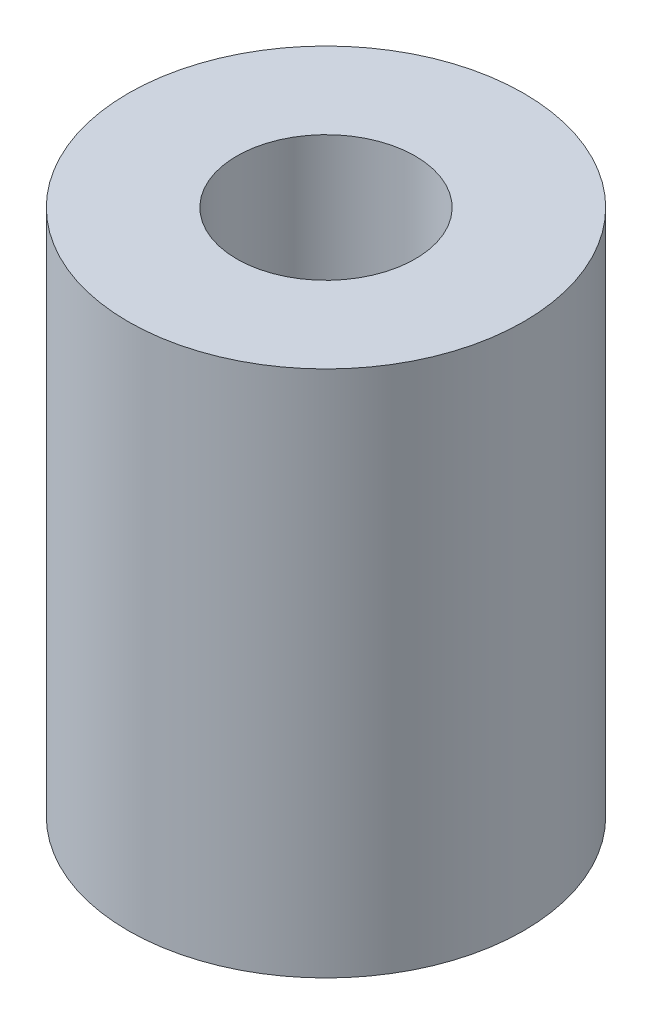
ISO-10303-21;
HEADER;
FILE_DESCRIPTION(('STEP AP214'),'2;1');
FILE_NAME('part.step','',(''),(''),'','','');
FILE_SCHEMA(('AUTOMOTIVE_DESIGN { 1 0 10303 214 1 1 1 1 }'));
ENDSEC;
DATA;
#1=APPLICATION_CONTEXT('core data for automotive mechanical design processes');
#2=APPLICATION_PROTOCOL_DEFINITION('international standard','automotive_design',2000,#1);
#3=PRODUCT_CONTEXT('',#1,'mechanical');
#4=PRODUCT('Part','Part','',(#3));
#5=PRODUCT_RELATED_PRODUCT_CATEGORY('part','',(#4));
#6=PRODUCT_DEFINITION_FORMATION('','',#4);
#7=PRODUCT_DEFINITION_CONTEXT('part definition',#1,'design');
#8=PRODUCT_DEFINITION('design','',#6,#7);
#9=PRODUCT_DEFINITION_SHAPE('','',#8);
#10=(LENGTH_UNIT() NAMED_UNIT(*) SI_UNIT(.MILLI.,.METRE.));
#11=(NAMED_UNIT(*) PLANE_ANGLE_UNIT() SI_UNIT($,.RADIAN.));
#12=(NAMED_UNIT(*) SI_UNIT($,.STERADIAN.) SOLID_ANGLE_UNIT());
#13=UNCERTAINTY_MEASURE_WITH_UNIT(LENGTH_MEASURE(1.E-05),#10,'distance_accuracy_value','');
#14=(GEOMETRIC_REPRESENTATION_CONTEXT(3) GLOBAL_UNCERTAINTY_ASSIGNED_CONTEXT((#13)) GLOBAL_UNIT_ASSIGNED_CONTEXT((#10,
#11,#12)) REPRESENTATION_CONTEXT('',''));
#15=CARTESIAN_POINT('',(0.,0.,0.));
#16=DIRECTION('',(0.,0.,1.));
#17=DIRECTION('',(1.,0.,0.));
#18=AXIS2_PLACEMENT_3D('',#15,#16,#17);
#19=CARTESIAN_POINT('',(0.,14.7777777777778,0.));
#20=DIRECTION('',(0.,1.,0.));
#21=DIRECTION('',(0.,0.,1.));
#22=AXIS2_PLACEMENT_3D('',#19,#20,#21);
#23=PLANE('',#22);
#24=CARTESIAN_POINT('',(0.,14.7777777777778,0.));
#25=DIRECTION('',(0.,1.,0.));
#26=DIRECTION('',(0.,0.,1.));
#27=AXIS2_PLACEMENT_3D('',#24,#25,#26);
#28=CIRCLE('',#27,11.0833333333333);
#29=CARTESIAN_POINT('',(0.,14.7777777777778,11.0833333333333));
#30=VERTEX_POINT('',#29);
#31=EDGE_CURVE('E10',#30,#30,#28,.T.);
#32=ORIENTED_EDGE('',*,*,#31,.T.);
#33=EDGE_LOOP('',(#32));
#34=FACE_BOUND('',#33,.T.);
#35=CARTESIAN_POINT('',(0.,14.7777777777778,0.));
#36=DIRECTION('',(0.,1.,0.));
#37=DIRECTION('',(0.,0.,1.));
#38=AXIS2_PLACEMENT_3D('',#35,#36,#37);
#39=CIRCLE('',#38,5.);
#40=CARTESIAN_POINT('',(0.,14.7777777777778,5.));
#41=VERTEX_POINT('',#40);
#42=EDGE_CURVE('E43',#41,#41,#39,.T.);
#43=ORIENTED_EDGE('',*,*,#42,.F.);
#44=EDGE_LOOP('',(#43));
#45=FACE_BOUND('',#44,.T.);
#46=ADVANCED_FACE('F32',(#34,#45),#23,.T.);
#47=CARTESIAN_POINT('',(0.,-14.7777777777778,0.));
#48=DIRECTION('',(0.,1.,0.));
#49=DIRECTION('',(0.,0.,1.));
#50=AXIS2_PLACEMENT_3D('',#47,#48,#49);
#51=PLANE('',#50);
#52=CARTESIAN_POINT('',(0.,-14.7777777777778,0.));
#53=DIRECTION('',(0.,1.,0.));
#54=DIRECTION('',(0.,0.,1.));
#55=AXIS2_PLACEMENT_3D('',#52,#53,#54);
#56=CIRCLE('',#55,11.0833333333333);
#57=CARTESIAN_POINT('',(0.,-14.7777777777778,11.0833333333333));
#58=VERTEX_POINT('',#57);
#59=EDGE_CURVE('E36',#58,#58,#56,.T.);
#60=ORIENTED_EDGE('',*,*,#59,.F.);
#61=EDGE_LOOP('',(#60));
#62=FACE_BOUND('',#61,.T.);
#63=CARTESIAN_POINT('',(0.,-14.7777777777778,0.));
#64=DIRECTION('',(0.,1.,0.));
#65=DIRECTION('',(0.,0.,1.));
#66=AXIS2_PLACEMENT_3D('',#63,#64,#65);
#67=CIRCLE('',#66,5.);
#68=CARTESIAN_POINT('',(0.,-14.7777777777778,5.));
#69=VERTEX_POINT('',#68);
#70=EDGE_CURVE('E45',#69,#69,#67,.T.);
#71=ORIENTED_EDGE('',*,*,#70,.T.);
#72=EDGE_LOOP('',(#71));
#73=FACE_BOUND('',#72,.T.);
#74=ADVANCED_FACE('F55',(#62,#73),#51,.F.);
#75=CARTESIAN_POINT('',(0.,14.7777777777778,0.));
#76=DIRECTION('',(0.,-1.,0.));
#77=DIRECTION('',(0.,0.,-1.));
#78=AXIS2_PLACEMENT_3D('',#75,#76,#77);
#79=CYLINDRICAL_SURFACE('',#78,11.0833333333333);
#80=ORIENTED_EDGE('',*,*,#31,.F.);
#81=EDGE_LOOP('',(#80));
#82=FACE_BOUND('',#81,.T.);
#83=ORIENTED_EDGE('',*,*,#59,.T.);
#84=EDGE_LOOP('',(#83));
#85=FACE_BOUND('',#84,.T.);
#86=ADVANCED_FACE('F34',(#82,#85),#79,.T.);
#87=CARTESIAN_POINT('',(0.,14.7777777777778,0.));
#88=DIRECTION('',(0.,-1.,0.));
#89=DIRECTION('',(0.,0.,-1.));
#90=AXIS2_PLACEMENT_3D('',#87,#88,#89);
#91=CYLINDRICAL_SURFACE('',#90,5.);
#92=ORIENTED_EDGE('',*,*,#42,.T.);
#93=EDGE_LOOP('',(#92));
#94=FACE_BOUND('',#93,.T.);
#95=ORIENTED_EDGE('',*,*,#70,.F.);
#96=EDGE_LOOP('',(#95));
#97=FACE_BOUND('',#96,.T.);
#98=ADVANCED_FACE('F51',(#94,#97),#91,.F.);
#99=CLOSED_SHELL('',(#46,#74,#86,#98));
#100=MANIFOLD_SOLID_BREP('B2',#99);
#101=ADVANCED_BREP_SHAPE_REPRESENTATION('',(#18,#100),#14);
#102=SHAPE_DEFINITION_REPRESENTATION(#9,#101);
ENDSEC;
END-ISO-10303-21;
